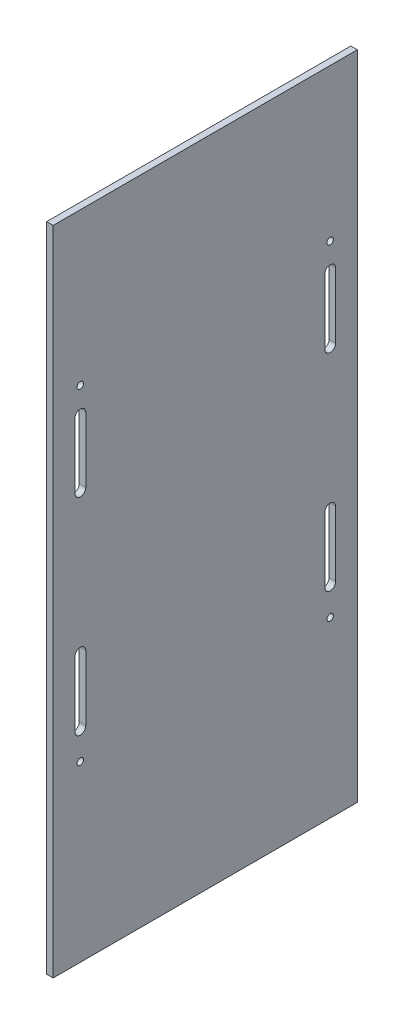
ISO-10303-21;
HEADER;
FILE_DESCRIPTION(('STEP AP214'),'2;1');
FILE_NAME('part.step','',(''),(''),'','','');
FILE_SCHEMA(('AUTOMOTIVE_DESIGN { 1 0 10303 214 1 1 1 1 }'));
ENDSEC;
DATA;
#1=APPLICATION_CONTEXT('core data for automotive mechanical design processes');
#2=APPLICATION_PROTOCOL_DEFINITION('international standard','automotive_design',2000,#1);
#3=PRODUCT_CONTEXT('',#1,'mechanical');
#4=PRODUCT('Part','Part','',(#3));
#5=PRODUCT_RELATED_PRODUCT_CATEGORY('part','',(#4));
#6=PRODUCT_DEFINITION_FORMATION('','',#4);
#7=PRODUCT_DEFINITION_CONTEXT('part definition',#1,'design');
#8=PRODUCT_DEFINITION('design','',#6,#7);
#9=PRODUCT_DEFINITION_SHAPE('','',#8);
#10=(LENGTH_UNIT() NAMED_UNIT(*) SI_UNIT(.MILLI.,.METRE.));
#11=(NAMED_UNIT(*) PLANE_ANGLE_UNIT() SI_UNIT($,.RADIAN.));
#12=(NAMED_UNIT(*) SI_UNIT($,.STERADIAN.) SOLID_ANGLE_UNIT());
#13=UNCERTAINTY_MEASURE_WITH_UNIT(LENGTH_MEASURE(1.E-05),#10,'distance_accuracy_value','');
#14=(GEOMETRIC_REPRESENTATION_CONTEXT(3) GLOBAL_UNCERTAINTY_ASSIGNED_CONTEXT((#13)) GLOBAL_UNIT_ASSIGNED_CONTEXT((#10,
#11,#12)) REPRESENTATION_CONTEXT('',''));
#15=CARTESIAN_POINT('',(0.,0.,0.));
#16=DIRECTION('',(0.,0.,1.));
#17=DIRECTION('',(1.,0.,0.));
#18=AXIS2_PLACEMENT_3D('',#15,#16,#17);
#19=CARTESIAN_POINT('',(-2.99999999999999,300.,-70.));
#20=DIRECTION('',(1.,0.,0.));
#21=DIRECTION('',(0.,0.,-1.));
#22=AXIS2_PLACEMENT_3D('',#19,#20,#21);
#23=PLANE('',#22);
#24=DIRECTION('',(0.,-1.,0.));
#25=VECTOR('',#24,1.);
#26=CARTESIAN_POINT('',(-2.99999999999999,188.059956426707,-60.0000000000011));
#27=LINE('',#26,#25);
#28=CARTESIAN_POINT('',(-2.99999999999999,218.059956426707,-60.000000000001));
#29=VERTEX_POINT('',#28);
#30=CARTESIAN_POINT('',(-2.99999999999999,188.059956426707,-60.0000000000001));
#31=VERTEX_POINT('',#30);
#32=EDGE_CURVE('E231',#29,#31,#27,.T.);
#33=ORIENTED_EDGE('',*,*,#32,.F.);
#34=CARTESIAN_POINT('',(-2.99999999999999,218.059956426707,-57.4999999999991));
#35=DIRECTION('',(-1.,0.,0.));
#36=DIRECTION('',(0.,0.,1.));
#37=AXIS2_PLACEMENT_3D('',#34,#35,#36);
#38=CIRCLE('',#37,2.50000000000098);
#39=CARTESIAN_POINT('',(-2.99999999999999,218.059956426707,-54.9999999999991));
#40=VERTEX_POINT('',#39);
#41=EDGE_CURVE('E52',#40,#29,#38,.T.);
#42=ORIENTED_EDGE('',*,*,#41,.F.);
#43=DIRECTION('',(0.,1.,0.));
#44=VECTOR('',#43,1.);
#45=CARTESIAN_POINT('',(-2.99999999999999,218.059956426707,-54.9999999999991));
#46=LINE('',#45,#44);
#47=CARTESIAN_POINT('',(-2.99999999999999,188.059956426707,-54.9999999999991));
#48=VERTEX_POINT('',#47);
#49=EDGE_CURVE('E220',#48,#40,#46,.T.);
#50=ORIENTED_EDGE('',*,*,#49,.F.);
#51=CARTESIAN_POINT('',(-2.99999999999999,188.059956426707,-57.4999999999991));
#52=DIRECTION('',(-1.,0.,0.));
#53=DIRECTION('',(0.,0.,1.));
#54=AXIS2_PLACEMENT_3D('',#51,#52,#53);
#55=CIRCLE('',#54,2.50000000000099);
#56=EDGE_CURVE('E235',#31,#48,#55,.T.);
#57=ORIENTED_EDGE('',*,*,#56,.F.);
#58=EDGE_LOOP('',(#33,#42,#50,#57));
#59=FACE_BOUND('',#58,.T.);
#60=DIRECTION('',(0.,-1.,0.));
#61=VECTOR('',#60,1.);
#62=CARTESIAN_POINT('',(-2.99999999999999,93.0599564267058,54.9999999999999));
#63=LINE('',#62,#61);
#64=CARTESIAN_POINT('',(-2.99999999999999,123.059956426706,54.9999999999999));
#65=VERTEX_POINT('',#64);
#66=CARTESIAN_POINT('',(-2.99999999999999,93.0599564267058,54.9999999999999));
#67=VERTEX_POINT('',#66);
#68=EDGE_CURVE('E263',#65,#67,#63,.T.);
#69=ORIENTED_EDGE('',*,*,#68,.F.);
#70=CARTESIAN_POINT('',(-2.99999999999999,123.059956426706,57.4999999999999));
#71=DIRECTION('',(-1.,0.,0.));
#72=DIRECTION('',(0.,0.,1.));
#73=AXIS2_PLACEMENT_3D('',#70,#71,#72);
#74=CIRCLE('',#73,2.5);
#75=CARTESIAN_POINT('',(-2.99999999999999,123.059956426706,59.9999999999999));
#76=VERTEX_POINT('',#75);
#77=EDGE_CURVE('E60',#76,#65,#74,.T.);
#78=ORIENTED_EDGE('',*,*,#77,.F.);
#79=DIRECTION('',(0.,1.,0.));
#80=VECTOR('',#79,1.);
#81=CARTESIAN_POINT('',(-2.99999999999999,123.059956426706,59.9999999999999));
#82=LINE('',#81,#80);
#83=CARTESIAN_POINT('',(-2.99999999999999,93.0599564267058,59.9999999999999));
#84=VERTEX_POINT('',#83);
#85=EDGE_CURVE('E252',#84,#76,#82,.T.);
#86=ORIENTED_EDGE('',*,*,#85,.F.);
#87=CARTESIAN_POINT('',(-2.99999999999999,93.0599564267058,57.4999999999999));
#88=DIRECTION('',(-1.,0.,0.));
#89=DIRECTION('',(0.,0.,1.));
#90=AXIS2_PLACEMENT_3D('',#87,#88,#89);
#91=CIRCLE('',#90,2.49999999999999);
#92=EDGE_CURVE('E266',#67,#84,#91,.T.);
#93=ORIENTED_EDGE('',*,*,#92,.F.);
#94=EDGE_LOOP('',(#69,#78,#86,#93));
#95=FACE_BOUND('',#94,.T.);
#96=DIRECTION('',(0.,-1.,0.));
#97=VECTOR('',#96,1.);
#98=CARTESIAN_POINT('',(-2.99999999999999,188.059956426706,54.999999999999));
#99=LINE('',#98,#97);
#100=CARTESIAN_POINT('',(-2.99999999999999,218.059956426706,54.999999999999));
#101=VERTEX_POINT('',#100);
#102=CARTESIAN_POINT('',(-2.99999999999999,188.059956426706,54.9999999999999));
#103=VERTEX_POINT('',#102);
#104=EDGE_CURVE('E207',#101,#103,#99,.T.);
#105=ORIENTED_EDGE('',*,*,#104,.F.);
#106=CARTESIAN_POINT('',(-2.99999999999999,218.059956426706,57.5000000000009));
#107=DIRECTION('',(-1.,0.,0.));
#108=DIRECTION('',(0.,0.,1.));
#109=AXIS2_PLACEMENT_3D('',#106,#107,#108);
#110=CIRCLE('',#109,2.50000000000098);
#111=CARTESIAN_POINT('',(-2.99999999999999,218.059956426706,60.0000000000009));
#112=VERTEX_POINT('',#111);
#113=EDGE_CURVE('E180',#112,#101,#110,.T.);
#114=ORIENTED_EDGE('',*,*,#113,.F.);
#115=DIRECTION('',(0.,1.,0.));
#116=VECTOR('',#115,1.);
#117=CARTESIAN_POINT('',(-2.99999999999999,218.059956426706,60.0000000000009));
#118=LINE('',#117,#116);
#119=CARTESIAN_POINT('',(-2.99999999999999,188.059956426706,60.0000000000009));
#120=VERTEX_POINT('',#119);
#121=EDGE_CURVE('E198',#120,#112,#118,.T.);
#122=ORIENTED_EDGE('',*,*,#121,.F.);
#123=CARTESIAN_POINT('',(-2.99999999999999,188.059956426706,57.5000000000009));
#124=DIRECTION('',(-1.,0.,0.));
#125=DIRECTION('',(0.,0.,1.));
#126=AXIS2_PLACEMENT_3D('',#123,#124,#125);
#127=CIRCLE('',#126,2.50000000000098);
#128=EDGE_CURVE('E201',#103,#120,#127,.T.);
#129=ORIENTED_EDGE('',*,*,#128,.F.);
#130=EDGE_LOOP('',(#105,#114,#122,#129));
#131=FACE_BOUND('',#130,.T.);
#132=DIRECTION('',(0.,1.,0.));
#133=VECTOR('',#132,1.);
#134=CARTESIAN_POINT('',(-2.99999999999999,123.059956426707,-55.0000000000001));
#135=LINE('',#134,#133);
#136=CARTESIAN_POINT('',(-2.99999999999999,93.0599564267066,-55.0000000000001));
#137=VERTEX_POINT('',#136);
#138=CARTESIAN_POINT('',(-2.99999999999999,123.059956426707,-55.0000000000001));
#139=VERTEX_POINT('',#138);
#140=EDGE_CURVE('E292',#137,#139,#135,.T.);
#141=ORIENTED_EDGE('',*,*,#140,.F.);
#142=CARTESIAN_POINT('',(-2.99999999999999,93.0599564267066,-57.5000000000001));
#143=DIRECTION('',(-1.,0.,0.));
#144=DIRECTION('',(0.,0.,1.));
#145=AXIS2_PLACEMENT_3D('',#142,#143,#144);
#146=CIRCLE('',#145,2.5);
#147=CARTESIAN_POINT('',(-2.99999999999999,93.0599564267066,-60.0000000000001));
#148=VERTEX_POINT('',#147);
#149=EDGE_CURVE('E242',#148,#137,#146,.T.);
#150=ORIENTED_EDGE('',*,*,#149,.F.);
#151=DIRECTION('',(0.,-1.,0.));
#152=VECTOR('',#151,1.);
#153=CARTESIAN_POINT('',(-2.99999999999999,93.0599564267066,-60.0000000000001));
#154=LINE('',#153,#152);
#155=CARTESIAN_POINT('',(-2.99999999999999,123.059956426707,-60.0000000000001));
#156=VERTEX_POINT('',#155);
#157=EDGE_CURVE('E281',#156,#148,#154,.T.);
#158=ORIENTED_EDGE('',*,*,#157,.F.);
#159=CARTESIAN_POINT('',(-2.99999999999999,123.059956426707,-57.5000000000001));
#160=DIRECTION('',(-1.,0.,0.));
#161=DIRECTION('',(0.,0.,1.));
#162=AXIS2_PLACEMENT_3D('',#159,#160,#161);
#163=CIRCLE('',#162,2.49999999999999);
#164=EDGE_CURVE('E295',#139,#156,#163,.T.);
#165=ORIENTED_EDGE('',*,*,#164,.F.);
#166=EDGE_LOOP('',(#141,#150,#158,#165));
#167=FACE_BOUND('',#166,.T.);
#168=CARTESIAN_POINT('',(-2.99999999999999,80.,57.5));
#169=DIRECTION('',(-1.,0.,0.));
#170=DIRECTION('',(0.,0.,1.));
#171=AXIS2_PLACEMENT_3D('',#168,#169,#170);
#172=CIRCLE('',#171,1.5);
#173=CARTESIAN_POINT('',(-2.99999999999999,80.,59.));
#174=VERTEX_POINT('',#173);
#175=EDGE_CURVE('E319',#174,#174,#172,.T.);
#176=ORIENTED_EDGE('',*,*,#175,.F.);
#177=EDGE_LOOP('',(#176));
#178=FACE_BOUND('',#177,.T.);
#179=CARTESIAN_POINT('',(-2.99999999999999,230.,-57.5000000000005));
#180=DIRECTION('',(-1.,0.,0.));
#181=DIRECTION('',(0.,0.,1.));
#182=AXIS2_PLACEMENT_3D('',#179,#180,#181);
#183=CIRCLE('',#182,1.5);
#184=CARTESIAN_POINT('',(-2.99999999999999,230.,-56.0000000000005));
#185=VERTEX_POINT('',#184);
#186=EDGE_CURVE('E312',#185,#185,#183,.T.);
#187=ORIENTED_EDGE('',*,*,#186,.F.);
#188=EDGE_LOOP('',(#187));
#189=FACE_BOUND('',#188,.T.);
#190=CARTESIAN_POINT('',(-2.99999999999999,230.,57.4999999999995));
#191=DIRECTION('',(-1.,0.,0.));
#192=DIRECTION('',(0.,0.,1.));
#193=AXIS2_PLACEMENT_3D('',#190,#191,#192);
#194=CIRCLE('',#193,1.5);
#195=CARTESIAN_POINT('',(-2.99999999999999,230.,58.9999999999995));
#196=VERTEX_POINT('',#195);
#197=EDGE_CURVE('E302',#196,#196,#194,.T.);
#198=ORIENTED_EDGE('',*,*,#197,.F.);
#199=EDGE_LOOP('',(#198));
#200=FACE_BOUND('',#199,.T.);
#201=CARTESIAN_POINT('',(-2.99999999999999,80.,-57.5));
#202=DIRECTION('',(-1.,0.,0.));
#203=DIRECTION('',(0.,0.,1.));
#204=AXIS2_PLACEMENT_3D('',#201,#202,#203);
#205=CIRCLE('',#204,1.5);
#206=CARTESIAN_POINT('',(-2.99999999999999,80.,-56.));
#207=VERTEX_POINT('',#206);
#208=EDGE_CURVE('E318',#207,#207,#205,.T.);
#209=ORIENTED_EDGE('',*,*,#208,.F.);
#210=EDGE_LOOP('',(#209));
#211=FACE_BOUND('',#210,.T.);
#212=DIRECTION('',(0.,0.,-1.));
#213=VECTOR('',#212,1.);
#214=CARTESIAN_POINT('',(-2.99999999999999,0.,-70.));
#215=LINE('',#214,#213);
#216=CARTESIAN_POINT('',(-2.99999999999999,0.,-70.));
#217=VERTEX_POINT('',#216);
#218=CARTESIAN_POINT('',(-2.99999999999999,0.,70.));
#219=VERTEX_POINT('',#218);
#220=EDGE_CURVE('E330',#217,#219,#215,.F.);
#221=ORIENTED_EDGE('',*,*,#220,.T.);
#222=DIRECTION('',(0.,-1.,0.));
#223=VECTOR('',#222,1.);
#224=CARTESIAN_POINT('',(-2.99999999999999,300.,70.));
#225=LINE('',#224,#223);
#226=CARTESIAN_POINT('',(-2.99999999999999,300.,70.));
#227=VERTEX_POINT('',#226);
#228=EDGE_CURVE('E11',#227,#219,#225,.T.);
#229=ORIENTED_EDGE('',*,*,#228,.F.);
#230=DIRECTION('',(0.,0.,-1.));
#231=VECTOR('',#230,1.);
#232=CARTESIAN_POINT('',(-2.99999999999999,300.,-70.));
#233=LINE('',#232,#231);
#234=CARTESIAN_POINT('',(-2.99999999999999,300.,-70.));
#235=VERTEX_POINT('',#234);
#236=EDGE_CURVE('E333',#235,#227,#233,.F.);
#237=ORIENTED_EDGE('',*,*,#236,.F.);
#238=DIRECTION('',(0.,-1.,0.));
#239=VECTOR('',#238,1.);
#240=CARTESIAN_POINT('',(-2.99999999999999,300.,-70.));
#241=LINE('',#240,#239);
#242=EDGE_CURVE('E345',#235,#217,#241,.T.);
#243=ORIENTED_EDGE('',*,*,#242,.T.);
#244=EDGE_LOOP('',(#221,#229,#237,#243));
#245=FACE_BOUND('',#244,.T.);
#246=ADVANCED_FACE('F38',(#59,#95,#131,#167,#178,#189,#200,#211,#245),#23,.F.);
#247=CARTESIAN_POINT('',(0.,300.,70.));
#248=DIRECTION('',(0.,0.,1.));
#249=DIRECTION('',(1.,0.,0.));
#250=AXIS2_PLACEMENT_3D('',#247,#248,#249);
#251=PLANE('',#250);
#252=DIRECTION('',(-1.,0.,0.));
#253=VECTOR('',#252,1.);
#254=CARTESIAN_POINT('',(0.,0.,70.));
#255=LINE('',#254,#253);
#256=CARTESIAN_POINT('',(0.,0.,70.));
#257=VERTEX_POINT('',#256);
#258=EDGE_CURVE('E348',#257,#219,#255,.T.);
#259=ORIENTED_EDGE('',*,*,#258,.F.);
#260=DIRECTION('',(0.,-1.,0.));
#261=VECTOR('',#260,1.);
#262=CARTESIAN_POINT('',(0.,300.,70.));
#263=LINE('',#262,#261);
#264=CARTESIAN_POINT('',(0.,300.,70.));
#265=VERTEX_POINT('',#264);
#266=EDGE_CURVE('E45',#265,#257,#263,.T.);
#267=ORIENTED_EDGE('',*,*,#266,.F.);
#268=DIRECTION('',(-1.,0.,0.));
#269=VECTOR('',#268,1.);
#270=CARTESIAN_POINT('',(0.,300.,70.));
#271=LINE('',#270,#269);
#272=EDGE_CURVE('E335',#265,#227,#271,.T.);
#273=ORIENTED_EDGE('',*,*,#272,.T.);
#274=ORIENTED_EDGE('',*,*,#228,.T.);
#275=EDGE_LOOP('',(#259,#267,#273,#274));
#276=FACE_BOUND('',#275,.T.);
#277=ADVANCED_FACE('F364',(#276),#251,.T.);
#278=CARTESIAN_POINT('',(0.,300.,-70.));
#279=DIRECTION('',(1.,0.,0.));
#280=DIRECTION('',(0.,0.,-1.));
#281=AXIS2_PLACEMENT_3D('',#278,#279,#280);
#282=PLANE('',#281);
#283=CARTESIAN_POINT('',(0.,218.059956426707,-57.4999999999991));
#284=DIRECTION('',(-1.,0.,0.));
#285=DIRECTION('',(0.,0.,1.));
#286=AXIS2_PLACEMENT_3D('',#283,#284,#285);
#287=CIRCLE('',#286,2.50000000000098);
#288=CARTESIAN_POINT('',(0.,218.059956426707,-54.9999999999991));
#289=VERTEX_POINT('',#288);
#290=CARTESIAN_POINT('',(0.,218.059956426707,-60.000000000001));
#291=VERTEX_POINT('',#290);
#292=EDGE_CURVE('E216',#289,#291,#287,.T.);
#293=ORIENTED_EDGE('',*,*,#292,.T.);
#294=DIRECTION('',(0.,-1.,0.));
#295=VECTOR('',#294,1.);
#296=CARTESIAN_POINT('',(0.,188.059956426707,-60.0000000000011));
#297=LINE('',#296,#295);
#298=CARTESIAN_POINT('',(0.,188.059956426707,-60.0000000000011));
#299=VERTEX_POINT('',#298);
#300=EDGE_CURVE('E219',#291,#299,#297,.T.);
#301=ORIENTED_EDGE('',*,*,#300,.T.);
#302=CARTESIAN_POINT('',(0.,188.059956426707,-57.4999999999991));
#303=DIRECTION('',(-1.,0.,0.));
#304=DIRECTION('',(0.,0.,1.));
#305=AXIS2_PLACEMENT_3D('',#302,#303,#304);
#306=CIRCLE('',#305,2.50000000000099);
#307=CARTESIAN_POINT('',(0.,188.059956426707,-54.9999999999991));
#308=VERTEX_POINT('',#307);
#309=EDGE_CURVE('E223',#299,#308,#306,.T.);
#310=ORIENTED_EDGE('',*,*,#309,.T.);
#311=DIRECTION('',(0.,1.,0.));
#312=VECTOR('',#311,1.);
#313=CARTESIAN_POINT('',(0.,218.059956426707,-54.9999999999991));
#314=LINE('',#313,#312);
#315=EDGE_CURVE('E226',#308,#289,#314,.T.);
#316=ORIENTED_EDGE('',*,*,#315,.T.);
#317=EDGE_LOOP('',(#293,#301,#310,#316));
#318=FACE_BOUND('',#317,.T.);
#319=CARTESIAN_POINT('',(0.,123.059956426706,57.4999999999999));
#320=DIRECTION('',(-1.,0.,0.));
#321=DIRECTION('',(0.,0.,1.));
#322=AXIS2_PLACEMENT_3D('',#319,#320,#321);
#323=CIRCLE('',#322,2.5);
#324=CARTESIAN_POINT('',(0.,123.059956426706,59.9999999999999));
#325=VERTEX_POINT('',#324);
#326=CARTESIAN_POINT('',(0.,123.059956426706,54.9999999999999));
#327=VERTEX_POINT('',#326);
#328=EDGE_CURVE('E248',#325,#327,#323,.T.);
#329=ORIENTED_EDGE('',*,*,#328,.T.);
#330=DIRECTION('',(0.,-1.,0.));
#331=VECTOR('',#330,1.);
#332=CARTESIAN_POINT('',(0.,93.0599564267058,54.9999999999999));
#333=LINE('',#332,#331);
#334=CARTESIAN_POINT('',(0.,93.0599564267058,54.9999999999999));
#335=VERTEX_POINT('',#334);
#336=EDGE_CURVE('E251',#327,#335,#333,.T.);
#337=ORIENTED_EDGE('',*,*,#336,.T.);
#338=CARTESIAN_POINT('',(0.,93.0599564267058,57.4999999999999));
#339=DIRECTION('',(-1.,0.,0.));
#340=DIRECTION('',(0.,0.,1.));
#341=AXIS2_PLACEMENT_3D('',#338,#339,#340);
#342=CIRCLE('',#341,2.49999999999999);
#343=CARTESIAN_POINT('',(0.,93.0599564267058,59.9999999999999));
#344=VERTEX_POINT('',#343);
#345=EDGE_CURVE('E255',#335,#344,#342,.T.);
#346=ORIENTED_EDGE('',*,*,#345,.T.);
#347=DIRECTION('',(0.,1.,0.));
#348=VECTOR('',#347,1.);
#349=CARTESIAN_POINT('',(0.,123.059956426706,59.9999999999999));
#350=LINE('',#349,#348);
#351=EDGE_CURVE('E258',#344,#325,#350,.T.);
#352=ORIENTED_EDGE('',*,*,#351,.T.);
#353=EDGE_LOOP('',(#329,#337,#346,#352));
#354=FACE_BOUND('',#353,.T.);
#355=CARTESIAN_POINT('',(0.,218.059956426706,57.5000000000009));
#356=DIRECTION('',(-1.,0.,0.));
#357=DIRECTION('',(0.,0.,1.));
#358=AXIS2_PLACEMENT_3D('',#355,#356,#357);
#359=CIRCLE('',#358,2.50000000000098);
#360=CARTESIAN_POINT('',(0.,218.059956426706,60.0000000000009));
#361=VERTEX_POINT('',#360);
#362=CARTESIAN_POINT('',(0.,218.059956426706,54.999999999999));
#363=VERTEX_POINT('',#362);
#364=EDGE_CURVE('E177',#361,#363,#359,.T.);
#365=ORIENTED_EDGE('',*,*,#364,.T.);
#366=DIRECTION('',(0.,-1.,0.));
#367=VECTOR('',#366,1.);
#368=CARTESIAN_POINT('',(0.,188.059956426706,54.999999999999));
#369=LINE('',#368,#367);
#370=CARTESIAN_POINT('',(0.,188.059956426706,54.999999999999));
#371=VERTEX_POINT('',#370);
#372=EDGE_CURVE('E189',#363,#371,#369,.T.);
#373=ORIENTED_EDGE('',*,*,#372,.T.);
#374=CARTESIAN_POINT('',(0.,188.059956426706,57.5000000000009));
#375=DIRECTION('',(-1.,0.,0.));
#376=DIRECTION('',(0.,0.,1.));
#377=AXIS2_PLACEMENT_3D('',#374,#375,#376);
#378=CIRCLE('',#377,2.50000000000098);
#379=CARTESIAN_POINT('',(0.,188.059956426706,60.0000000000009));
#380=VERTEX_POINT('',#379);
#381=EDGE_CURVE('E193',#371,#380,#378,.T.);
#382=ORIENTED_EDGE('',*,*,#381,.T.);
#383=DIRECTION('',(0.,1.,0.));
#384=VECTOR('',#383,1.);
#385=CARTESIAN_POINT('',(0.,218.059956426706,60.0000000000009));
#386=LINE('',#385,#384);
#387=EDGE_CURVE('E185',#380,#361,#386,.T.);
#388=ORIENTED_EDGE('',*,*,#387,.T.);
#389=EDGE_LOOP('',(#365,#373,#382,#388));
#390=FACE_BOUND('',#389,.T.);
#391=CARTESIAN_POINT('',(0.,93.0599564267066,-57.5000000000001));
#392=DIRECTION('',(-1.,0.,0.));
#393=DIRECTION('',(0.,0.,1.));
#394=AXIS2_PLACEMENT_3D('',#391,#392,#393);
#395=CIRCLE('',#394,2.5);
#396=CARTESIAN_POINT('',(0.,93.0599564267066,-60.0000000000001));
#397=VERTEX_POINT('',#396);
#398=CARTESIAN_POINT('',(0.,93.0599564267066,-55.0000000000001));
#399=VERTEX_POINT('',#398);
#400=EDGE_CURVE('E277',#397,#399,#395,.T.);
#401=ORIENTED_EDGE('',*,*,#400,.T.);
#402=DIRECTION('',(0.,1.,0.));
#403=VECTOR('',#402,1.);
#404=CARTESIAN_POINT('',(0.,123.059956426707,-55.0000000000001));
#405=LINE('',#404,#403);
#406=CARTESIAN_POINT('',(0.,123.059956426707,-55.0000000000001));
#407=VERTEX_POINT('',#406);
#408=EDGE_CURVE('E280',#399,#407,#405,.T.);
#409=ORIENTED_EDGE('',*,*,#408,.T.);
#410=CARTESIAN_POINT('',(0.,123.059956426707,-57.5000000000001));
#411=DIRECTION('',(-1.,0.,0.));
#412=DIRECTION('',(0.,0.,1.));
#413=AXIS2_PLACEMENT_3D('',#410,#411,#412);
#414=CIRCLE('',#413,2.49999999999999);
#415=CARTESIAN_POINT('',(0.,123.059956426707,-60.0000000000001));
#416=VERTEX_POINT('',#415);
#417=EDGE_CURVE('E284',#407,#416,#414,.T.);
#418=ORIENTED_EDGE('',*,*,#417,.T.);
#419=DIRECTION('',(0.,-1.,0.));
#420=VECTOR('',#419,1.);
#421=CARTESIAN_POINT('',(0.,93.0599564267066,-60.0000000000001));
#422=LINE('',#421,#420);
#423=EDGE_CURVE('E287',#416,#397,#422,.T.);
#424=ORIENTED_EDGE('',*,*,#423,.T.);
#425=EDGE_LOOP('',(#401,#409,#418,#424));
#426=FACE_BOUND('',#425,.T.);
#427=CARTESIAN_POINT('',(0.,80.,57.5));
#428=DIRECTION('',(-1.,0.,0.));
#429=DIRECTION('',(0.,0.,1.));
#430=AXIS2_PLACEMENT_3D('',#427,#428,#429);
#431=CIRCLE('',#430,1.5);
#432=CARTESIAN_POINT('',(0.,80.,59.));
#433=VERTEX_POINT('',#432);
#434=EDGE_CURVE('E315',#433,#433,#431,.T.);
#435=ORIENTED_EDGE('',*,*,#434,.T.);
#436=EDGE_LOOP('',(#435));
#437=FACE_BOUND('',#436,.T.);
#438=CARTESIAN_POINT('',(0.,230.,-57.5000000000005));
#439=DIRECTION('',(-1.,0.,0.));
#440=DIRECTION('',(0.,0.,1.));
#441=AXIS2_PLACEMENT_3D('',#438,#439,#440);
#442=CIRCLE('',#441,1.5);
#443=CARTESIAN_POINT('',(0.,230.,-56.0000000000005));
#444=VERTEX_POINT('',#443);
#445=EDGE_CURVE('E322',#444,#444,#442,.T.);
#446=ORIENTED_EDGE('',*,*,#445,.T.);
#447=EDGE_LOOP('',(#446));
#448=FACE_BOUND('',#447,.T.);
#449=CARTESIAN_POINT('',(0.,230.,57.4999999999995));
#450=DIRECTION('',(-1.,0.,0.));
#451=DIRECTION('',(0.,0.,1.));
#452=AXIS2_PLACEMENT_3D('',#449,#450,#451);
#453=CIRCLE('',#452,1.5);
#454=CARTESIAN_POINT('',(0.,230.,58.9999999999995));
#455=VERTEX_POINT('',#454);
#456=EDGE_CURVE('E309',#455,#455,#453,.T.);
#457=ORIENTED_EDGE('',*,*,#456,.T.);
#458=EDGE_LOOP('',(#457));
#459=FACE_BOUND('',#458,.T.);
#460=CARTESIAN_POINT('',(0.,80.,-57.5));
#461=DIRECTION('',(-1.,0.,0.));
#462=DIRECTION('',(0.,0.,1.));
#463=AXIS2_PLACEMENT_3D('',#460,#461,#462);
#464=CIRCLE('',#463,1.5);
#465=CARTESIAN_POINT('',(0.,80.,-56.));
#466=VERTEX_POINT('',#465);
#467=EDGE_CURVE('E327',#466,#466,#464,.T.);
#468=ORIENTED_EDGE('',*,*,#467,.T.);
#469=EDGE_LOOP('',(#468));
#470=FACE_BOUND('',#469,.T.);
#471=DIRECTION('',(0.,0.,1.));
#472=VECTOR('',#471,1.);
#473=CARTESIAN_POINT('',(0.,0.,-70.));
#474=LINE('',#473,#472);
#475=CARTESIAN_POINT('',(0.,0.,-70.));
#476=VERTEX_POINT('',#475);
#477=EDGE_CURVE('E351',#476,#257,#474,.T.);
#478=ORIENTED_EDGE('',*,*,#477,.F.);
#479=DIRECTION('',(0.,-1.,0.));
#480=VECTOR('',#479,1.);
#481=CARTESIAN_POINT('',(0.,300.,-70.));
#482=LINE('',#481,#480);
#483=CARTESIAN_POINT('',(0.,300.,-70.));
#484=VERTEX_POINT('',#483);
#485=EDGE_CURVE('E357',#484,#476,#482,.T.);
#486=ORIENTED_EDGE('',*,*,#485,.F.);
#487=DIRECTION('',(0.,0.,1.));
#488=VECTOR('',#487,1.);
#489=CARTESIAN_POINT('',(0.,300.,-70.));
#490=LINE('',#489,#488);
#491=EDGE_CURVE('E339',#484,#265,#490,.T.);
#492=ORIENTED_EDGE('',*,*,#491,.T.);
#493=ORIENTED_EDGE('',*,*,#266,.T.);
#494=EDGE_LOOP('',(#478,#486,#492,#493));
#495=FACE_BOUND('',#494,.T.);
#496=ADVANCED_FACE('F195',(#318,#354,#390,#426,#437,#448,#459,#470,#495),#282,.T.);
#497=CARTESIAN_POINT('',(-2.99999999999999,300.,-70.));
#498=DIRECTION('',(0.,0.,-1.));
#499=DIRECTION('',(-1.,0.,0.));
#500=AXIS2_PLACEMENT_3D('',#497,#498,#499);
#501=PLANE('',#500);
#502=DIRECTION('',(1.,0.,0.));
#503=VECTOR('',#502,1.);
#504=CARTESIAN_POINT('',(-2.99999999999999,0.,-70.));
#505=LINE('',#504,#503);
#506=EDGE_CURVE('E336',#217,#476,#505,.T.);
#507=ORIENTED_EDGE('',*,*,#506,.F.);
#508=ORIENTED_EDGE('',*,*,#242,.F.);
#509=DIRECTION('',(1.,0.,0.));
#510=VECTOR('',#509,1.);
#511=CARTESIAN_POINT('',(-2.99999999999999,300.,-70.));
#512=LINE('',#511,#510);
#513=EDGE_CURVE('E342',#235,#484,#512,.T.);
#514=ORIENTED_EDGE('',*,*,#513,.T.);
#515=ORIENTED_EDGE('',*,*,#485,.T.);
#516=EDGE_LOOP('',(#507,#508,#514,#515));
#517=FACE_BOUND('',#516,.T.);
#518=ADVANCED_FACE('F371',(#517),#501,.T.);
#519=CARTESIAN_POINT('',(0.,300.,0.));
#520=DIRECTION('',(0.,1.,0.));
#521=DIRECTION('',(1.,0.,0.));
#522=AXIS2_PLACEMENT_3D('',#519,#520,#521);
#523=PLANE('',#522);
#524=ORIENTED_EDGE('',*,*,#236,.T.);
#525=ORIENTED_EDGE('',*,*,#272,.F.);
#526=ORIENTED_EDGE('',*,*,#491,.F.);
#527=ORIENTED_EDGE('',*,*,#513,.F.);
#528=EDGE_LOOP('',(#524,#525,#526,#527));
#529=FACE_BOUND('',#528,.T.);
#530=ADVANCED_FACE('F375',(#529),#523,.T.);
#531=CARTESIAN_POINT('',(0.,0.,0.));
#532=DIRECTION('',(0.,1.,0.));
#533=DIRECTION('',(1.,0.,0.));
#534=AXIS2_PLACEMENT_3D('',#531,#532,#533);
#535=PLANE('',#534);
#536=ORIENTED_EDGE('',*,*,#220,.F.);
#537=ORIENTED_EDGE('',*,*,#506,.T.);
#538=ORIENTED_EDGE('',*,*,#477,.T.);
#539=ORIENTED_EDGE('',*,*,#258,.T.);
#540=EDGE_LOOP('',(#536,#537,#538,#539));
#541=FACE_BOUND('',#540,.T.);
#542=ADVANCED_FACE('F368',(#541),#535,.F.);
#543=CARTESIAN_POINT('',(0.,80.,-57.5));
#544=DIRECTION('',(-1.,0.,0.));
#545=DIRECTION('',(0.,0.,1.));
#546=AXIS2_PLACEMENT_3D('',#543,#544,#545);
#547=CYLINDRICAL_SURFACE('',#546,1.5);
#548=ORIENTED_EDGE('',*,*,#467,.F.);
#549=EDGE_LOOP('',(#548));
#550=FACE_BOUND('',#549,.T.);
#551=ORIENTED_EDGE('',*,*,#208,.T.);
#552=EDGE_LOOP('',(#551));
#553=FACE_BOUND('',#552,.T.);
#554=ADVANCED_FACE('F404',(#550,#553),#547,.F.);
#555=CARTESIAN_POINT('',(0.,230.,57.4999999999995));
#556=DIRECTION('',(-1.,0.,0.));
#557=DIRECTION('',(0.,0.,1.));
#558=AXIS2_PLACEMENT_3D('',#555,#556,#557);
#559=CYLINDRICAL_SURFACE('',#558,1.5);
#560=ORIENTED_EDGE('',*,*,#456,.F.);
#561=EDGE_LOOP('',(#560));
#562=FACE_BOUND('',#561,.T.);
#563=ORIENTED_EDGE('',*,*,#197,.T.);
#564=EDGE_LOOP('',(#563));
#565=FACE_BOUND('',#564,.T.);
#566=ADVANCED_FACE('F406',(#562,#565),#559,.F.);
#567=CARTESIAN_POINT('',(0.,230.,-57.5000000000005));
#568=DIRECTION('',(-1.,0.,0.));
#569=DIRECTION('',(0.,0.,1.));
#570=AXIS2_PLACEMENT_3D('',#567,#568,#569);
#571=CYLINDRICAL_SURFACE('',#570,1.5);
#572=ORIENTED_EDGE('',*,*,#445,.F.);
#573=EDGE_LOOP('',(#572));
#574=FACE_BOUND('',#573,.T.);
#575=ORIENTED_EDGE('',*,*,#186,.T.);
#576=EDGE_LOOP('',(#575));
#577=FACE_BOUND('',#576,.T.);
#578=ADVANCED_FACE('F413',(#574,#577),#571,.F.);
#579=CARTESIAN_POINT('',(0.,80.,57.5));
#580=DIRECTION('',(-1.,0.,0.));
#581=DIRECTION('',(0.,0.,1.));
#582=AXIS2_PLACEMENT_3D('',#579,#580,#581);
#583=CYLINDRICAL_SURFACE('',#582,1.5);
#584=ORIENTED_EDGE('',*,*,#434,.F.);
#585=EDGE_LOOP('',(#584));
#586=FACE_BOUND('',#585,.T.);
#587=ORIENTED_EDGE('',*,*,#175,.T.);
#588=EDGE_LOOP('',(#587));
#589=FACE_BOUND('',#588,.T.);
#590=ADVANCED_FACE('F471',(#586,#589),#583,.F.);
#591=CARTESIAN_POINT('',(0.,93.0599564267066,-57.5000000000001));
#592=DIRECTION('',(-1.,0.,0.));
#593=DIRECTION('',(0.,0.,1.));
#594=AXIS2_PLACEMENT_3D('',#591,#592,#593);
#595=CYLINDRICAL_SURFACE('',#594,2.5);
#596=ORIENTED_EDGE('',*,*,#149,.T.);
#597=DIRECTION('',(-1.,0.,0.));
#598=VECTOR('',#597,1.);
#599=CARTESIAN_POINT('',(0.,93.0599564267066,-55.0000000000001));
#600=LINE('',#599,#598);
#601=EDGE_CURVE('E290',#399,#137,#600,.T.);
#602=ORIENTED_EDGE('',*,*,#601,.F.);
#603=ORIENTED_EDGE('',*,*,#400,.F.);
#604=DIRECTION('',(-1.,0.,0.));
#605=VECTOR('',#604,1.);
#606=CARTESIAN_POINT('',(0.,93.0599564267066,-60.0000000000001));
#607=LINE('',#606,#605);
#608=EDGE_CURVE('E300',#397,#148,#607,.T.);
#609=ORIENTED_EDGE('',*,*,#608,.T.);
#610=EDGE_LOOP('',(#596,#602,#603,#609));
#611=FACE_BOUND('',#610,.T.);
#612=ADVANCED_FACE('F461',(#611),#595,.F.);
#613=CARTESIAN_POINT('',(0.,93.0599564267066,-60.0000000000001));
#614=DIRECTION('',(0.,0.,-1.));
#615=DIRECTION('',(0.,1.,0.));
#616=AXIS2_PLACEMENT_3D('',#613,#614,#615);
#617=PLANE('',#616);
#618=ORIENTED_EDGE('',*,*,#157,.T.);
#619=ORIENTED_EDGE('',*,*,#608,.F.);
#620=ORIENTED_EDGE('',*,*,#423,.F.);
#621=DIRECTION('',(-1.,0.,0.));
#622=VECTOR('',#621,1.);
#623=CARTESIAN_POINT('',(0.,123.059956426707,-60.0000000000001));
#624=LINE('',#623,#622);
#625=EDGE_CURVE('E303',#416,#156,#624,.T.);
#626=ORIENTED_EDGE('',*,*,#625,.T.);
#627=EDGE_LOOP('',(#618,#619,#620,#626));
#628=FACE_BOUND('',#627,.T.);
#629=ADVANCED_FACE('F457',(#628),#617,.F.);
#630=CARTESIAN_POINT('',(0.,123.059956426707,-57.5000000000001));
#631=DIRECTION('',(-1.,0.,0.));
#632=DIRECTION('',(0.,0.,1.));
#633=AXIS2_PLACEMENT_3D('',#630,#631,#632);
#634=CYLINDRICAL_SURFACE('',#633,2.49999999999999);
#635=ORIENTED_EDGE('',*,*,#164,.T.);
#636=ORIENTED_EDGE('',*,*,#625,.F.);
#637=ORIENTED_EDGE('',*,*,#417,.F.);
#638=DIRECTION('',(-1.,0.,0.));
#639=VECTOR('',#638,1.);
#640=CARTESIAN_POINT('',(0.,123.059956426707,-55.0000000000001));
#641=LINE('',#640,#639);
#642=EDGE_CURVE('E305',#407,#139,#641,.T.);
#643=ORIENTED_EDGE('',*,*,#642,.T.);
#644=EDGE_LOOP('',(#635,#636,#637,#643));
#645=FACE_BOUND('',#644,.T.);
#646=ADVANCED_FACE('F460',(#645),#634,.F.);
#647=CARTESIAN_POINT('',(0.,123.059956426707,-55.0000000000001));
#648=DIRECTION('',(0.,0.,1.));
#649=DIRECTION('',(0.,-1.,0.));
#650=AXIS2_PLACEMENT_3D('',#647,#648,#649);
#651=PLANE('',#650);
#652=ORIENTED_EDGE('',*,*,#140,.T.);
#653=ORIENTED_EDGE('',*,*,#642,.F.);
#654=ORIENTED_EDGE('',*,*,#408,.F.);
#655=ORIENTED_EDGE('',*,*,#601,.T.);
#656=EDGE_LOOP('',(#652,#653,#654,#655));
#657=FACE_BOUND('',#656,.T.);
#658=ADVANCED_FACE('F465',(#657),#651,.F.);
#659=CARTESIAN_POINT('',(0.,218.059956426706,57.5000000000009));
#660=DIRECTION('',(-1.,0.,0.));
#661=DIRECTION('',(0.,0.,1.));
#662=AXIS2_PLACEMENT_3D('',#659,#660,#661);
#663=CYLINDRICAL_SURFACE('',#662,2.50000000000098);
#664=ORIENTED_EDGE('',*,*,#113,.T.);
#665=DIRECTION('',(-1.,0.,0.));
#666=VECTOR('',#665,1.);
#667=CARTESIAN_POINT('',(0.,218.059956426706,54.999999999999));
#668=LINE('',#667,#666);
#669=EDGE_CURVE('E173',#363,#101,#668,.T.);
#670=ORIENTED_EDGE('',*,*,#669,.F.);
#671=ORIENTED_EDGE('',*,*,#364,.F.);
#672=DIRECTION('',(-1.,0.,0.));
#673=VECTOR('',#672,1.);
#674=CARTESIAN_POINT('',(0.,218.059956426706,60.0000000000009));
#675=LINE('',#674,#673);
#676=EDGE_CURVE('E211',#361,#112,#675,.T.);
#677=ORIENTED_EDGE('',*,*,#676,.T.);
#678=EDGE_LOOP('',(#664,#670,#671,#677));
#679=FACE_BOUND('',#678,.T.);
#680=ADVANCED_FACE('F175',(#679),#663,.F.);
#681=CARTESIAN_POINT('',(0.,218.059956426706,60.0000000000009));
#682=DIRECTION('',(0.,0.,1.));
#683=DIRECTION('',(0.,-1.,0.));
#684=AXIS2_PLACEMENT_3D('',#681,#682,#683);
#685=PLANE('',#684);
#686=ORIENTED_EDGE('',*,*,#121,.T.);
#687=ORIENTED_EDGE('',*,*,#676,.F.);
#688=ORIENTED_EDGE('',*,*,#387,.F.);
#689=DIRECTION('',(-1.,0.,0.));
#690=VECTOR('',#689,1.);
#691=CARTESIAN_POINT('',(0.,188.059956426706,60.0000000000009));
#692=LINE('',#691,#690);
#693=EDGE_CURVE('E213',#380,#120,#692,.T.);
#694=ORIENTED_EDGE('',*,*,#693,.T.);
#695=EDGE_LOOP('',(#686,#687,#688,#694));
#696=FACE_BOUND('',#695,.T.);
#697=ADVANCED_FACE('F584',(#696),#685,.F.);
#698=CARTESIAN_POINT('',(0.,188.059956426706,57.5000000000009));
#699=DIRECTION('',(-1.,0.,0.));
#700=DIRECTION('',(0.,0.,1.));
#701=AXIS2_PLACEMENT_3D('',#698,#699,#700);
#702=CYLINDRICAL_SURFACE('',#701,2.50000000000098);
#703=ORIENTED_EDGE('',*,*,#128,.T.);
#704=ORIENTED_EDGE('',*,*,#693,.F.);
#705=ORIENTED_EDGE('',*,*,#381,.F.);
#706=DIRECTION('',(-1.,0.,0.));
#707=VECTOR('',#706,1.);
#708=CARTESIAN_POINT('',(0.,188.059956426706,54.9999999999999));
#709=LINE('',#708,#707);
#710=EDGE_CURVE('E184',#371,#103,#709,.T.);
#711=ORIENTED_EDGE('',*,*,#710,.T.);
#712=EDGE_LOOP('',(#703,#704,#705,#711));
#713=FACE_BOUND('',#712,.T.);
#714=ADVANCED_FACE('F593',(#713),#702,.F.);
#715=CARTESIAN_POINT('',(0.,188.059956426706,54.999999999999));
#716=DIRECTION('',(0.,0.,-1.));
#717=DIRECTION('',(0.,1.,0.));
#718=AXIS2_PLACEMENT_3D('',#715,#716,#717);
#719=PLANE('',#718);
#720=ORIENTED_EDGE('',*,*,#104,.T.);
#721=ORIENTED_EDGE('',*,*,#710,.F.);
#722=ORIENTED_EDGE('',*,*,#372,.F.);
#723=ORIENTED_EDGE('',*,*,#669,.T.);
#724=EDGE_LOOP('',(#720,#721,#722,#723));
#725=FACE_BOUND('',#724,.T.);
#726=ADVANCED_FACE('F190',(#725),#719,.F.);
#727=CARTESIAN_POINT('',(0.,123.059956426706,57.4999999999999));
#728=DIRECTION('',(-1.,0.,0.));
#729=DIRECTION('',(0.,0.,1.));
#730=AXIS2_PLACEMENT_3D('',#727,#728,#729);
#731=CYLINDRICAL_SURFACE('',#730,2.5);
#732=ORIENTED_EDGE('',*,*,#77,.T.);
#733=DIRECTION('',(-1.,0.,0.));
#734=VECTOR('',#733,1.);
#735=CARTESIAN_POINT('',(0.,123.059956426706,54.9999999999999));
#736=LINE('',#735,#734);
#737=EDGE_CURVE('E261',#327,#65,#736,.T.);
#738=ORIENTED_EDGE('',*,*,#737,.F.);
#739=ORIENTED_EDGE('',*,*,#328,.F.);
#740=DIRECTION('',(-1.,0.,0.));
#741=VECTOR('',#740,1.);
#742=CARTESIAN_POINT('',(0.,123.059956426706,59.9999999999999));
#743=LINE('',#742,#741);
#744=EDGE_CURVE('E232',#325,#76,#743,.T.);
#745=ORIENTED_EDGE('',*,*,#744,.T.);
#746=EDGE_LOOP('',(#732,#738,#739,#745));
#747=FACE_BOUND('',#746,.T.);
#748=ADVANCED_FACE('F434',(#747),#731,.F.);
#749=CARTESIAN_POINT('',(0.,123.059956426706,59.9999999999999));
#750=DIRECTION('',(0.,0.,1.));
#751=DIRECTION('',(0.,-1.,0.));
#752=AXIS2_PLACEMENT_3D('',#749,#750,#751);
#753=PLANE('',#752);
#754=ORIENTED_EDGE('',*,*,#85,.T.);
#755=ORIENTED_EDGE('',*,*,#744,.F.);
#756=ORIENTED_EDGE('',*,*,#351,.F.);
#757=DIRECTION('',(-1.,0.,0.));
#758=VECTOR('',#757,1.);
#759=CARTESIAN_POINT('',(0.,93.0599564267058,59.9999999999999));
#760=LINE('',#759,#758);
#761=EDGE_CURVE('E272',#344,#84,#760,.T.);
#762=ORIENTED_EDGE('',*,*,#761,.T.);
#763=EDGE_LOOP('',(#754,#755,#756,#762));
#764=FACE_BOUND('',#763,.T.);
#765=ADVANCED_FACE('F442',(#764),#753,.F.);
#766=CARTESIAN_POINT('',(0.,93.0599564267058,57.4999999999999));
#767=DIRECTION('',(-1.,0.,0.));
#768=DIRECTION('',(0.,0.,1.));
#769=AXIS2_PLACEMENT_3D('',#766,#767,#768);
#770=CYLINDRICAL_SURFACE('',#769,2.49999999999999);
#771=ORIENTED_EDGE('',*,*,#92,.T.);
#772=ORIENTED_EDGE('',*,*,#761,.F.);
#773=ORIENTED_EDGE('',*,*,#345,.F.);
#774=DIRECTION('',(-1.,0.,0.));
#775=VECTOR('',#774,1.);
#776=CARTESIAN_POINT('',(0.,93.0599564267058,54.9999999999999));
#777=LINE('',#776,#775);
#778=EDGE_CURVE('E274',#335,#67,#777,.T.);
#779=ORIENTED_EDGE('',*,*,#778,.T.);
#780=EDGE_LOOP('',(#771,#772,#773,#779));
#781=FACE_BOUND('',#780,.T.);
#782=ADVANCED_FACE('F439',(#781),#770,.F.);
#783=CARTESIAN_POINT('',(0.,93.0599564267058,54.9999999999999));
#784=DIRECTION('',(0.,0.,-1.));
#785=DIRECTION('',(-1.,0.,0.));
#786=AXIS2_PLACEMENT_3D('',#783,#784,#785);
#787=PLANE('',#786);
#788=ORIENTED_EDGE('',*,*,#68,.T.);
#789=ORIENTED_EDGE('',*,*,#778,.F.);
#790=ORIENTED_EDGE('',*,*,#336,.F.);
#791=ORIENTED_EDGE('',*,*,#737,.T.);
#792=EDGE_LOOP('',(#788,#789,#790,#791));
#793=FACE_BOUND('',#792,.T.);
#794=ADVANCED_FACE('F437',(#793),#787,.F.);
#795=CARTESIAN_POINT('',(0.,218.059956426707,-57.4999999999991));
#796=DIRECTION('',(-1.,0.,0.));
#797=DIRECTION('',(0.,0.,1.));
#798=AXIS2_PLACEMENT_3D('',#795,#796,#797);
#799=CYLINDRICAL_SURFACE('',#798,2.50000000000098);
#800=ORIENTED_EDGE('',*,*,#41,.T.);
#801=DIRECTION('',(-1.,0.,0.));
#802=VECTOR('',#801,1.);
#803=CARTESIAN_POINT('',(0.,218.059956426707,-60.000000000001));
#804=LINE('',#803,#802);
#805=EDGE_CURVE('E229',#291,#29,#804,.T.);
#806=ORIENTED_EDGE('',*,*,#805,.F.);
#807=ORIENTED_EDGE('',*,*,#292,.F.);
#808=DIRECTION('',(-1.,0.,0.));
#809=VECTOR('',#808,1.);
#810=CARTESIAN_POINT('',(0.,218.059956426707,-54.9999999999991));
#811=LINE('',#810,#809);
#812=EDGE_CURVE('E240',#289,#40,#811,.T.);
#813=ORIENTED_EDGE('',*,*,#812,.T.);
#814=EDGE_LOOP('',(#800,#806,#807,#813));
#815=FACE_BOUND('',#814,.T.);
#816=ADVANCED_FACE('F452',(#815),#799,.F.);
#817=CARTESIAN_POINT('',(0.,218.059956426707,-54.9999999999991));
#818=DIRECTION('',(0.,0.,1.));
#819=DIRECTION('',(1.,0.,0.));
#820=AXIS2_PLACEMENT_3D('',#817,#818,#819);
#821=PLANE('',#820);
#822=ORIENTED_EDGE('',*,*,#49,.T.);
#823=ORIENTED_EDGE('',*,*,#812,.F.);
#824=ORIENTED_EDGE('',*,*,#315,.F.);
#825=DIRECTION('',(-1.,0.,0.));
#826=VECTOR('',#825,1.);
#827=CARTESIAN_POINT('',(0.,188.059956426707,-54.9999999999991));
#828=LINE('',#827,#826);
#829=EDGE_CURVE('E243',#308,#48,#828,.T.);
#830=ORIENTED_EDGE('',*,*,#829,.T.);
#831=EDGE_LOOP('',(#822,#823,#824,#830));
#832=FACE_BOUND('',#831,.T.);
#833=ADVANCED_FACE('F643',(#832),#821,.F.);
#834=CARTESIAN_POINT('',(0.,188.059956426707,-57.4999999999991));
#835=DIRECTION('',(-1.,0.,0.));
#836=DIRECTION('',(0.,0.,1.));
#837=AXIS2_PLACEMENT_3D('',#834,#835,#836);
#838=CYLINDRICAL_SURFACE('',#837,2.50000000000099);
#839=ORIENTED_EDGE('',*,*,#56,.T.);
#840=ORIENTED_EDGE('',*,*,#829,.F.);
#841=ORIENTED_EDGE('',*,*,#309,.F.);
#842=DIRECTION('',(-1.,0.,0.));
#843=VECTOR('',#842,1.);
#844=CARTESIAN_POINT('',(0.,188.059956426707,-60.0000000000001));
#845=LINE('',#844,#843);
#846=EDGE_CURVE('E245',#299,#31,#845,.T.);
#847=ORIENTED_EDGE('',*,*,#846,.T.);
#848=EDGE_LOOP('',(#839,#840,#841,#847));
#849=FACE_BOUND('',#848,.T.);
#850=ADVANCED_FACE('F651',(#849),#838,.F.);
#851=CARTESIAN_POINT('',(0.,188.059956426707,-60.0000000000011));
#852=DIRECTION('',(0.,0.,-1.));
#853=DIRECTION('',(0.,1.,0.));
#854=AXIS2_PLACEMENT_3D('',#851,#852,#853);
#855=PLANE('',#854);
#856=ORIENTED_EDGE('',*,*,#32,.T.);
#857=ORIENTED_EDGE('',*,*,#846,.F.);
#858=ORIENTED_EDGE('',*,*,#300,.F.);
#859=ORIENTED_EDGE('',*,*,#805,.T.);
#860=EDGE_LOOP('',(#856,#857,#858,#859));
#861=FACE_BOUND('',#860,.T.);
#862=ADVANCED_FACE('F661',(#861),#855,.F.);
#863=CLOSED_SHELL('',(#246,#277,#496,#518,#530,#542,#554,#566,#578,#590,#612,#629,#646,#658,
#680,#697,#714,#726,#748,#765,#782,#794,#816,#833,#850,#862));
#864=MANIFOLD_SOLID_BREP('B2',#863);
#865=ADVANCED_BREP_SHAPE_REPRESENTATION('',(#18,#864),#14);
#866=SHAPE_DEFINITION_REPRESENTATION(#9,#865);
ENDSEC;
END-ISO-10303-21;
